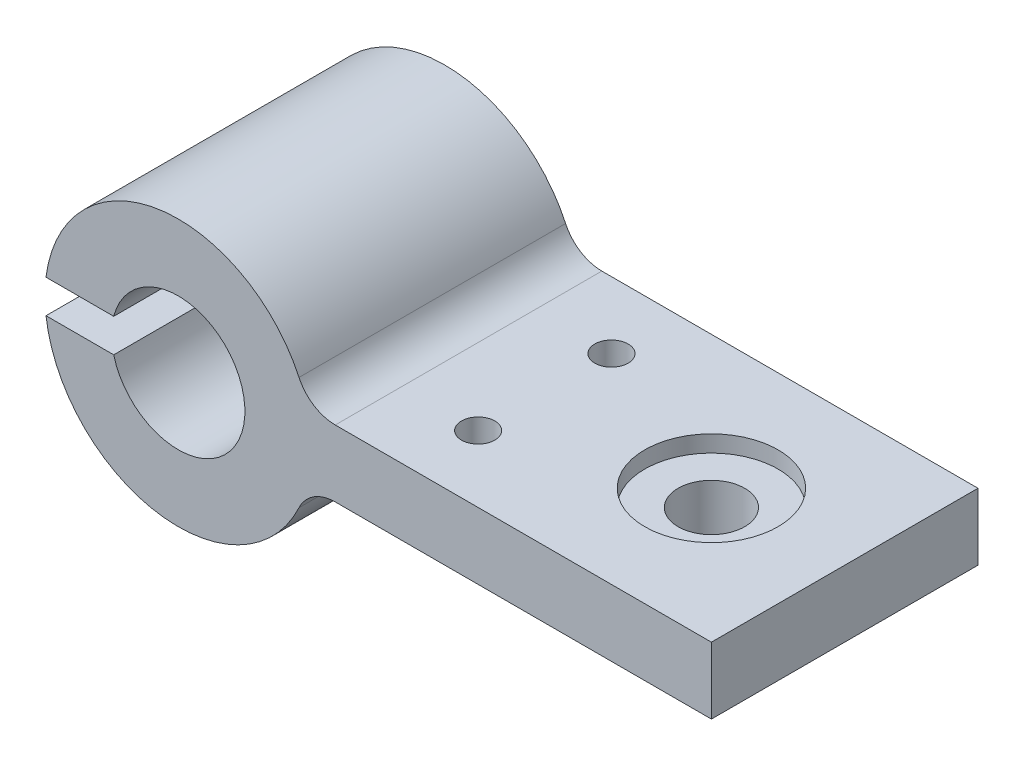
ISO-10303-21;
HEADER;
FILE_DESCRIPTION(('STEP AP214'),'2;1');
FILE_NAME('part.step','',(''),(''),'','','');
FILE_SCHEMA(('AUTOMOTIVE_DESIGN { 1 0 10303 214 1 1 1 1 }'));
ENDSEC;
DATA;
#1=APPLICATION_CONTEXT('core data for automotive mechanical design processes');
#2=APPLICATION_PROTOCOL_DEFINITION('international standard','automotive_design',2000,#1);
#3=PRODUCT_CONTEXT('',#1,'mechanical');
#4=PRODUCT('Part','Part','',(#3));
#5=PRODUCT_RELATED_PRODUCT_CATEGORY('part','',(#4));
#6=PRODUCT_DEFINITION_FORMATION('','',#4);
#7=PRODUCT_DEFINITION_CONTEXT('part definition',#1,'design');
#8=PRODUCT_DEFINITION('design','',#6,#7);
#9=PRODUCT_DEFINITION_SHAPE('','',#8);
#10=(LENGTH_UNIT() NAMED_UNIT(*) SI_UNIT(.MILLI.,.METRE.));
#11=(NAMED_UNIT(*) PLANE_ANGLE_UNIT() SI_UNIT($,.RADIAN.));
#12=(NAMED_UNIT(*) SI_UNIT($,.STERADIAN.) SOLID_ANGLE_UNIT());
#13=UNCERTAINTY_MEASURE_WITH_UNIT(LENGTH_MEASURE(1.E-05),#10,'distance_accuracy_value','');
#14=(GEOMETRIC_REPRESENTATION_CONTEXT(3) GLOBAL_UNCERTAINTY_ASSIGNED_CONTEXT((#13)) GLOBAL_UNIT_ASSIGNED_CONTEXT((#10,
#11,#12)) REPRESENTATION_CONTEXT('',''));
#15=CARTESIAN_POINT('',(0.,0.,0.));
#16=DIRECTION('',(0.,0.,1.));
#17=DIRECTION('',(1.,0.,0.));
#18=AXIS2_PLACEMENT_3D('',#15,#16,#17);
#19=CARTESIAN_POINT('',(0.,0.,50.8));
#20=DIRECTION('',(0.,0.,-1.));
#21=DIRECTION('',(-1.,0.,0.));
#22=AXIS2_PLACEMENT_3D('',#19,#20,#21);
#23=CYLINDRICAL_SURFACE('',#22,25.4);
#24=DIRECTION('',(0.,0.,1.));
#25=VECTOR('',#24,1.);
#26=CARTESIAN_POINT('',(-25.2007812378902,3.175,0.));
#27=LINE('',#26,#25);
#28=CARTESIAN_POINT('',(-25.2007812378902,3.175,0.));
#29=VERTEX_POINT('',#28);
#30=CARTESIAN_POINT('',(-25.2007812378902,3.175,50.8));
#31=VERTEX_POINT('',#30);
#32=EDGE_CURVE('E212',#29,#31,#27,.T.);
#33=ORIENTED_EDGE('',*,*,#32,.T.);
#34=CARTESIAN_POINT('',(0.,0.,50.8));
#35=DIRECTION('',(0.,0.,1.));
#36=DIRECTION('',(1.,0.,0.));
#37=AXIS2_PLACEMENT_3D('',#34,#35,#36);
#38=CIRCLE('',#37,25.4);
#39=CARTESIAN_POINT('',(23.0147817177307,10.7461538461538,50.8));
#40=VERTEX_POINT('',#39);
#41=EDGE_CURVE('E189',#40,#31,#38,.T.);
#42=ORIENTED_EDGE('',*,*,#41,.F.);
#43=DIRECTION('',(0.,0.,-1.));
#44=VECTOR('',#43,1.);
#45=CARTESIAN_POINT('',(23.0147817177307,10.7461538461538,50.8));
#46=LINE('',#45,#44);
#47=CARTESIAN_POINT('',(23.0147817177307,10.7461538461538,0.));
#48=VERTEX_POINT('',#47);
#49=EDGE_CURVE('E11',#40,#48,#46,.T.);
#50=ORIENTED_EDGE('',*,*,#49,.T.);
#51=CARTESIAN_POINT('',(0.,0.,0.));
#52=DIRECTION('',(0.,0.,1.));
#53=DIRECTION('',(1.,0.,0.));
#54=AXIS2_PLACEMENT_3D('',#51,#52,#53);
#55=CIRCLE('',#54,25.4);
#56=EDGE_CURVE('E147',#48,#29,#55,.T.);
#57=ORIENTED_EDGE('',*,*,#56,.T.);
#58=EDGE_LOOP('',(#33,#42,#50,#57));
#59=FACE_BOUND('',#58,.T.);
#60=ADVANCED_FACE('F33',(#59),#23,.T.);
#61=CARTESIAN_POINT('',(29.91921623305,13.97,50.8));
#62=DIRECTION('',(0.,0.,-1.));
#63=DIRECTION('',(-1.,0.,0.));
#64=AXIS2_PLACEMENT_3D('',#61,#62,#63);
#65=CYLINDRICAL_SURFACE('',#64,7.62);
#66=CARTESIAN_POINT('',(29.91921623305,13.97,0.));
#67=DIRECTION('',(0.,0.,1.));
#68=DIRECTION('',(1.,0.,0.));
#69=AXIS2_PLACEMENT_3D('',#66,#67,#68);
#70=CIRCLE('',#69,7.62);
#71=CARTESIAN_POINT('',(29.91921623305,6.35,0.));
#72=VERTEX_POINT('',#71);
#73=EDGE_CURVE('E143',#48,#72,#70,.T.);
#74=ORIENTED_EDGE('',*,*,#73,.F.);
#75=ORIENTED_EDGE('',*,*,#49,.F.);
#76=CARTESIAN_POINT('',(29.91921623305,13.97,50.8));
#77=DIRECTION('',(0.,0.,1.));
#78=DIRECTION('',(1.,0.,0.));
#79=AXIS2_PLACEMENT_3D('',#76,#77,#78);
#80=CIRCLE('',#79,7.62);
#81=CARTESIAN_POINT('',(29.91921623305,6.35,50.8));
#82=VERTEX_POINT('',#81);
#83=EDGE_CURVE('E157',#40,#82,#80,.T.);
#84=ORIENTED_EDGE('',*,*,#83,.T.);
#85=DIRECTION('',(0.,0.,-1.));
#86=VECTOR('',#85,1.);
#87=CARTESIAN_POINT('',(29.91921623305,6.35,50.8));
#88=LINE('',#87,#86);
#89=EDGE_CURVE('E103',#82,#72,#88,.T.);
#90=ORIENTED_EDGE('',*,*,#89,.T.);
#91=EDGE_LOOP('',(#74,#75,#84,#90));
#92=FACE_BOUND('',#91,.T.);
#93=ADVANCED_FACE('F35',(#92),#65,.F.);
#94=CARTESIAN_POINT('',(-25.2007812378902,-3.175,50.8));
#95=VERTEX_POINT('',#94);
#96=CARTESIAN_POINT('',(23.0147817177307,-10.7461538461538,50.8));
#97=VERTEX_POINT('',#96);
#98=EDGE_CURVE('E188',#95,#97,#38,.T.);
#99=ORIENTED_EDGE('',*,*,#98,.F.);
#100=DIRECTION('',(0.,0.,1.));
#101=VECTOR('',#100,1.);
#102=CARTESIAN_POINT('',(-25.2007812378902,-3.175,0.));
#103=LINE('',#102,#101);
#104=CARTESIAN_POINT('',(-25.2007812378902,-3.175,0.));
#105=VERTEX_POINT('',#104);
#106=EDGE_CURVE('E72',#105,#95,#103,.T.);
#107=ORIENTED_EDGE('',*,*,#106,.F.);
#108=CARTESIAN_POINT('',(23.0147817177307,-10.7461538461538,0.));
#109=VERTEX_POINT('',#108);
#110=EDGE_CURVE('E145',#105,#109,#55,.T.);
#111=ORIENTED_EDGE('',*,*,#110,.T.);
#112=DIRECTION('',(0.,0.,-1.));
#113=VECTOR('',#112,1.);
#114=CARTESIAN_POINT('',(23.0147817177307,-10.7461538461538,50.8));
#115=LINE('',#114,#113);
#116=EDGE_CURVE('E43',#97,#109,#115,.T.);
#117=ORIENTED_EDGE('',*,*,#116,.F.);
#118=EDGE_LOOP('',(#99,#107,#111,#117));
#119=FACE_BOUND('',#118,.T.);
#120=ADVANCED_FACE('F199',(#119),#23,.T.);
#121=CARTESIAN_POINT('',(29.91921623305,-13.97,50.8));
#122=DIRECTION('',(0.,0.,-1.));
#123=DIRECTION('',(-1.,0.,0.));
#124=AXIS2_PLACEMENT_3D('',#121,#122,#123);
#125=CYLINDRICAL_SURFACE('',#124,7.62);
#126=CARTESIAN_POINT('',(29.91921623305,-13.97,0.));
#127=DIRECTION('',(0.,0.,1.));
#128=DIRECTION('',(1.,0.,0.));
#129=AXIS2_PLACEMENT_3D('',#126,#127,#128);
#130=CIRCLE('',#129,7.62);
#131=CARTESIAN_POINT('',(29.91921623305,-6.35,0.));
#132=VERTEX_POINT('',#131);
#133=EDGE_CURVE('E149',#132,#109,#130,.T.);
#134=ORIENTED_EDGE('',*,*,#133,.F.);
#135=DIRECTION('',(0.,0.,-1.));
#136=VECTOR('',#135,1.);
#137=CARTESIAN_POINT('',(29.91921623305,-6.35,50.8));
#138=LINE('',#137,#136);
#139=CARTESIAN_POINT('',(29.91921623305,-6.35,50.8));
#140=VERTEX_POINT('',#139);
#141=EDGE_CURVE('E160',#140,#132,#138,.T.);
#142=ORIENTED_EDGE('',*,*,#141,.F.);
#143=CARTESIAN_POINT('',(29.91921623305,-13.97,50.8));
#144=DIRECTION('',(0.,0.,1.));
#145=DIRECTION('',(1.,0.,0.));
#146=AXIS2_PLACEMENT_3D('',#143,#144,#145);
#147=CIRCLE('',#146,7.62);
#148=EDGE_CURVE('E191',#140,#97,#147,.T.);
#149=ORIENTED_EDGE('',*,*,#148,.T.);
#150=ORIENTED_EDGE('',*,*,#116,.T.);
#151=EDGE_LOOP('',(#134,#142,#149,#150));
#152=FACE_BOUND('',#151,.T.);
#153=ADVANCED_FACE('F195',(#152),#125,.F.);
#154=CARTESIAN_POINT('',(0.,-6.35,50.8));
#155=DIRECTION('',(0.,1.,0.));
#156=DIRECTION('',(0.,0.,1.));
#157=AXIS2_PLACEMENT_3D('',#154,#155,#156);
#158=PLANE('',#157);
#159=CARTESIAN_POINT('',(44.45,-6.35,12.7));
#160=DIRECTION('',(0.,1.,0.));
#161=DIRECTION('',(0.,0.,1.));
#162=AXIS2_PLACEMENT_3D('',#159,#160,#161);
#163=CIRCLE('',#162,3.175);
#164=CARTESIAN_POINT('',(44.45,-6.35,15.875));
#165=VERTEX_POINT('',#164);
#166=EDGE_CURVE('E223',#165,#165,#163,.T.);
#167=ORIENTED_EDGE('',*,*,#166,.T.);
#168=EDGE_LOOP('',(#167));
#169=FACE_BOUND('',#168,.T.);
#170=CARTESIAN_POINT('',(44.45,-6.35,38.1));
#171=DIRECTION('',(0.,1.,0.));
#172=DIRECTION('',(0.,0.,1.));
#173=AXIS2_PLACEMENT_3D('',#170,#171,#172);
#174=CIRCLE('',#173,3.175);
#175=CARTESIAN_POINT('',(44.45,-6.35,41.275));
#176=VERTEX_POINT('',#175);
#177=EDGE_CURVE('E283',#176,#176,#174,.T.);
#178=ORIENTED_EDGE('',*,*,#177,.T.);
#179=EDGE_LOOP('',(#178));
#180=FACE_BOUND('',#179,.T.);
#181=CARTESIAN_POINT('',(76.2,-6.35,25.4));
#182=DIRECTION('',(0.,1.,0.));
#183=DIRECTION('',(0.,0.,1.));
#184=AXIS2_PLACEMENT_3D('',#181,#182,#183);
#185=CIRCLE('',#184,6.35);
#186=CARTESIAN_POINT('',(76.2,-6.35,31.75));
#187=VERTEX_POINT('',#186);
#188=EDGE_CURVE('E164',#187,#187,#185,.T.);
#189=ORIENTED_EDGE('',*,*,#188,.T.);
#190=EDGE_LOOP('',(#189));
#191=FACE_BOUND('',#190,.T.);
#192=DIRECTION('',(1.,0.,0.));
#193=VECTOR('',#192,1.);
#194=CARTESIAN_POINT('',(0.,-6.35,0.));
#195=LINE('',#194,#193);
#196=CARTESIAN_POINT('',(101.6,-6.35,0.));
#197=VERTEX_POINT('',#196);
#198=EDGE_CURVE('E152',#132,#197,#195,.T.);
#199=ORIENTED_EDGE('',*,*,#198,.T.);
#200=DIRECTION('',(0.,0.,-1.));
#201=VECTOR('',#200,1.);
#202=CARTESIAN_POINT('',(101.6,-6.35,50.8));
#203=LINE('',#202,#201);
#204=CARTESIAN_POINT('',(101.6,-6.35,50.8));
#205=VERTEX_POINT('',#204);
#206=EDGE_CURVE('E126',#205,#197,#203,.T.);
#207=ORIENTED_EDGE('',*,*,#206,.F.);
#208=DIRECTION('',(1.,0.,0.));
#209=VECTOR('',#208,1.);
#210=CARTESIAN_POINT('',(0.,-6.35,50.8));
#211=LINE('',#210,#209);
#212=EDGE_CURVE('E135',#140,#205,#211,.T.);
#213=ORIENTED_EDGE('',*,*,#212,.F.);
#214=ORIENTED_EDGE('',*,*,#141,.T.);
#215=EDGE_LOOP('',(#199,#207,#213,#214));
#216=FACE_BOUND('',#215,.T.);
#217=ADVANCED_FACE('F237',(#169,#180,#191,#216),#158,.F.);
#218=CARTESIAN_POINT('',(101.6,0.,50.8));
#219=DIRECTION('',(1.,0.,0.));
#220=DIRECTION('',(0.,0.,-1.));
#221=AXIS2_PLACEMENT_3D('',#218,#219,#220);
#222=PLANE('',#221);
#223=DIRECTION('',(0.,-1.,0.));
#224=VECTOR('',#223,1.);
#225=CARTESIAN_POINT('',(101.6,0.,0.));
#226=LINE('',#225,#224);
#227=CARTESIAN_POINT('',(101.6,6.35,0.));
#228=VERTEX_POINT('',#227);
#229=EDGE_CURVE('E124',#228,#197,#226,.T.);
#230=ORIENTED_EDGE('',*,*,#229,.F.);
#231=DIRECTION('',(0.,0.,-1.));
#232=VECTOR('',#231,1.);
#233=CARTESIAN_POINT('',(101.6,6.35,50.8));
#234=LINE('',#233,#232);
#235=CARTESIAN_POINT('',(101.6,6.35,50.8));
#236=VERTEX_POINT('',#235);
#237=EDGE_CURVE('E96',#236,#228,#234,.T.);
#238=ORIENTED_EDGE('',*,*,#237,.F.);
#239=DIRECTION('',(0.,-1.,0.));
#240=VECTOR('',#239,1.);
#241=CARTESIAN_POINT('',(101.6,0.,50.8));
#242=LINE('',#241,#240);
#243=EDGE_CURVE('E122',#236,#205,#242,.T.);
#244=ORIENTED_EDGE('',*,*,#243,.T.);
#245=ORIENTED_EDGE('',*,*,#206,.T.);
#246=EDGE_LOOP('',(#230,#238,#244,#245));
#247=FACE_BOUND('',#246,.T.);
#248=ADVANCED_FACE('F121',(#247),#222,.T.);
#249=CARTESIAN_POINT('',(0.,6.35,50.8));
#250=DIRECTION('',(0.,1.,0.));
#251=DIRECTION('',(0.,0.,1.));
#252=AXIS2_PLACEMENT_3D('',#249,#250,#251);
#253=PLANE('',#252);
#254=CARTESIAN_POINT('',(44.45,6.35,12.7));
#255=DIRECTION('',(0.,1.,0.));
#256=DIRECTION('',(0.,0.,1.));
#257=AXIS2_PLACEMENT_3D('',#254,#255,#256);
#258=CIRCLE('',#257,3.175);
#259=CARTESIAN_POINT('',(44.45,6.35,15.875));
#260=VERTEX_POINT('',#259);
#261=EDGE_CURVE('E280',#260,#260,#258,.T.);
#262=ORIENTED_EDGE('',*,*,#261,.F.);
#263=EDGE_LOOP('',(#262));
#264=FACE_BOUND('',#263,.T.);
#265=CARTESIAN_POINT('',(44.45,6.35,38.1));
#266=DIRECTION('',(0.,1.,0.));
#267=DIRECTION('',(0.,0.,1.));
#268=AXIS2_PLACEMENT_3D('',#265,#266,#267);
#269=CIRCLE('',#268,3.175);
#270=CARTESIAN_POINT('',(44.45,6.35,41.275));
#271=VERTEX_POINT('',#270);
#272=EDGE_CURVE('E287',#271,#271,#269,.T.);
#273=ORIENTED_EDGE('',*,*,#272,.F.);
#274=EDGE_LOOP('',(#273));
#275=FACE_BOUND('',#274,.T.);
#276=CARTESIAN_POINT('',(76.2,6.35,25.4));
#277=DIRECTION('',(0.,1.,0.));
#278=DIRECTION('',(0.,0.,1.));
#279=AXIS2_PLACEMENT_3D('',#276,#277,#278);
#280=CIRCLE('',#279,12.7);
#281=CARTESIAN_POINT('',(76.2,6.35,38.1));
#282=VERTEX_POINT('',#281);
#283=EDGE_CURVE('E167',#282,#282,#280,.T.);
#284=ORIENTED_EDGE('',*,*,#283,.F.);
#285=EDGE_LOOP('',(#284));
#286=FACE_BOUND('',#285,.T.);
#287=DIRECTION('',(1.,0.,0.));
#288=VECTOR('',#287,1.);
#289=CARTESIAN_POINT('',(0.,6.35,0.));
#290=LINE('',#289,#288);
#291=EDGE_CURVE('E156',#72,#228,#290,.T.);
#292=ORIENTED_EDGE('',*,*,#291,.F.);
#293=ORIENTED_EDGE('',*,*,#89,.F.);
#294=DIRECTION('',(1.,0.,0.));
#295=VECTOR('',#294,1.);
#296=CARTESIAN_POINT('',(0.,6.35,50.8));
#297=LINE('',#296,#295);
#298=EDGE_CURVE('E132',#82,#236,#297,.T.);
#299=ORIENTED_EDGE('',*,*,#298,.T.);
#300=ORIENTED_EDGE('',*,*,#237,.T.);
#301=EDGE_LOOP('',(#292,#293,#299,#300));
#302=FACE_BOUND('',#301,.T.);
#303=ADVANCED_FACE('F138',(#264,#275,#286,#302),#253,.T.);
#304=CARTESIAN_POINT('',(0.,0.,50.8));
#305=DIRECTION('',(0.,0.,1.));
#306=DIRECTION('',(1.,0.,0.));
#307=AXIS2_PLACEMENT_3D('',#304,#305,#306);
#308=PLANE('',#307);
#309=DIRECTION('',(1.,0.,0.));
#310=VECTOR('',#309,1.);
#311=CARTESIAN_POINT('',(0.,-3.175,50.8));
#312=LINE('',#311,#310);
#313=CARTESIAN_POINT('',(-12.2967221242085,-3.175,50.8));
#314=VERTEX_POINT('',#313);
#315=EDGE_CURVE('E37',#95,#314,#312,.T.);
#316=ORIENTED_EDGE('',*,*,#315,.F.);
#317=ORIENTED_EDGE('',*,*,#98,.T.);
#318=ORIENTED_EDGE('',*,*,#148,.F.);
#319=ORIENTED_EDGE('',*,*,#212,.T.);
#320=ORIENTED_EDGE('',*,*,#243,.F.);
#321=ORIENTED_EDGE('',*,*,#298,.F.);
#322=ORIENTED_EDGE('',*,*,#83,.F.);
#323=ORIENTED_EDGE('',*,*,#41,.T.);
#324=DIRECTION('',(1.,0.,0.));
#325=VECTOR('',#324,1.);
#326=CARTESIAN_POINT('',(0.,3.175,50.8));
#327=LINE('',#326,#325);
#328=CARTESIAN_POINT('',(-12.2967221242085,3.175,50.8));
#329=VERTEX_POINT('',#328);
#330=EDGE_CURVE('E170',#31,#329,#327,.T.);
#331=ORIENTED_EDGE('',*,*,#330,.T.);
#332=CARTESIAN_POINT('',(0.,0.,50.8));
#333=DIRECTION('',(0.,0.,1.));
#334=DIRECTION('',(1.,0.,0.));
#335=AXIS2_PLACEMENT_3D('',#332,#333,#334);
#336=CIRCLE('',#335,12.7);
#337=EDGE_CURVE('E169',#314,#329,#336,.T.);
#338=ORIENTED_EDGE('',*,*,#337,.F.);
#339=EDGE_LOOP('',(#316,#317,#318,#319,#320,#321,#322,#323,#331,#338));
#340=FACE_BOUND('',#339,.T.);
#341=ADVANCED_FACE('F130',(#340),#308,.T.);
#342=CARTESIAN_POINT('',(0.,0.,0.));
#343=DIRECTION('',(0.,0.,1.));
#344=DIRECTION('',(1.,0.,0.));
#345=AXIS2_PLACEMENT_3D('',#342,#343,#344);
#346=PLANE('',#345);
#347=ORIENTED_EDGE('',*,*,#110,.F.);
#348=DIRECTION('',(1.,0.,0.));
#349=VECTOR('',#348,1.);
#350=CARTESIAN_POINT('',(0.,-3.175,0.));
#351=LINE('',#350,#349);
#352=CARTESIAN_POINT('',(-12.2967221242085,-3.175,0.));
#353=VERTEX_POINT('',#352);
#354=EDGE_CURVE('E206',#105,#353,#351,.T.);
#355=ORIENTED_EDGE('',*,*,#354,.T.);
#356=CARTESIAN_POINT('',(0.,0.,0.));
#357=DIRECTION('',(0.,0.,1.));
#358=DIRECTION('',(1.,0.,0.));
#359=AXIS2_PLACEMENT_3D('',#356,#357,#358);
#360=CIRCLE('',#359,12.7);
#361=CARTESIAN_POINT('',(-12.2967221242085,3.175,0.));
#362=VERTEX_POINT('',#361);
#363=EDGE_CURVE('E219',#353,#362,#360,.T.);
#364=ORIENTED_EDGE('',*,*,#363,.T.);
#365=DIRECTION('',(1.,0.,0.));
#366=VECTOR('',#365,1.);
#367=CARTESIAN_POINT('',(0.,3.175,0.));
#368=LINE('',#367,#366);
#369=EDGE_CURVE('E217',#29,#362,#368,.T.);
#370=ORIENTED_EDGE('',*,*,#369,.F.);
#371=ORIENTED_EDGE('',*,*,#56,.F.);
#372=ORIENTED_EDGE('',*,*,#73,.T.);
#373=ORIENTED_EDGE('',*,*,#291,.T.);
#374=ORIENTED_EDGE('',*,*,#229,.T.);
#375=ORIENTED_EDGE('',*,*,#198,.F.);
#376=ORIENTED_EDGE('',*,*,#133,.T.);
#377=EDGE_LOOP('',(#347,#355,#364,#370,#371,#372,#373,#374,#375,#376));
#378=FACE_BOUND('',#377,.T.);
#379=ADVANCED_FACE('F203',(#378),#346,.F.);
#380=CARTESIAN_POINT('',(76.2,3.175,25.4));
#381=DIRECTION('',(0.,1.,0.));
#382=DIRECTION('',(0.,0.,1.));
#383=AXIS2_PLACEMENT_3D('',#380,#381,#382);
#384=CYLINDRICAL_SURFACE('',#383,12.7);
#385=CARTESIAN_POINT('',(76.2,3.175,25.4));
#386=DIRECTION('',(0.,1.,0.));
#387=DIRECTION('',(0.,0.,1.));
#388=AXIS2_PLACEMENT_3D('',#385,#386,#387);
#389=CIRCLE('',#388,12.7);
#390=CARTESIAN_POINT('',(76.2,3.175,38.1));
#391=VERTEX_POINT('',#390);
#392=EDGE_CURVE('E146',#391,#391,#389,.T.);
#393=ORIENTED_EDGE('',*,*,#392,.F.);
#394=EDGE_LOOP('',(#393));
#395=FACE_BOUND('',#394,.T.);
#396=ORIENTED_EDGE('',*,*,#283,.T.);
#397=EDGE_LOOP('',(#396));
#398=FACE_BOUND('',#397,.T.);
#399=ADVANCED_FACE('F248',(#395,#398),#384,.F.);
#400=CARTESIAN_POINT('',(76.2,3.175,25.4));
#401=DIRECTION('',(0.,1.,0.));
#402=DIRECTION('',(0.,0.,1.));
#403=AXIS2_PLACEMENT_3D('',#400,#401,#402);
#404=PLANE('',#403);
#405=CARTESIAN_POINT('',(76.2,3.175,25.4));
#406=DIRECTION('',(0.,1.,0.));
#407=DIRECTION('',(0.,0.,1.));
#408=AXIS2_PLACEMENT_3D('',#405,#406,#407);
#409=CIRCLE('',#408,6.35);
#410=CARTESIAN_POINT('',(76.2,3.175,31.75));
#411=VERTEX_POINT('',#410);
#412=EDGE_CURVE('E168',#411,#411,#409,.T.);
#413=ORIENTED_EDGE('',*,*,#412,.F.);
#414=EDGE_LOOP('',(#413));
#415=FACE_BOUND('',#414,.T.);
#416=ORIENTED_EDGE('',*,*,#392,.T.);
#417=EDGE_LOOP('',(#416));
#418=FACE_BOUND('',#417,.T.);
#419=ADVANCED_FACE('F253',(#415,#418),#404,.T.);
#420=CARTESIAN_POINT('',(76.2,-25.4,25.4));
#421=DIRECTION('',(0.,1.,0.));
#422=DIRECTION('',(0.,0.,1.));
#423=AXIS2_PLACEMENT_3D('',#420,#421,#422);
#424=CYLINDRICAL_SURFACE('',#423,6.35);
#425=ORIENTED_EDGE('',*,*,#412,.T.);
#426=EDGE_LOOP('',(#425));
#427=FACE_BOUND('',#426,.T.);
#428=ORIENTED_EDGE('',*,*,#188,.F.);
#429=EDGE_LOOP('',(#428));
#430=FACE_BOUND('',#429,.T.);
#431=ADVANCED_FACE('F257',(#427,#430),#424,.F.);
#432=CARTESIAN_POINT('',(0.,-3.175,0.));
#433=DIRECTION('',(0.,-1.,0.));
#434=DIRECTION('',(0.,0.,-1.));
#435=AXIS2_PLACEMENT_3D('',#432,#433,#434);
#436=PLANE('',#435);
#437=ORIENTED_EDGE('',*,*,#315,.T.);
#438=DIRECTION('',(0.,0.,1.));
#439=VECTOR('',#438,1.);
#440=CARTESIAN_POINT('',(-12.2967221242085,-3.175,0.));
#441=LINE('',#440,#439);
#442=EDGE_CURVE('E215',#353,#314,#441,.T.);
#443=ORIENTED_EDGE('',*,*,#442,.F.);
#444=ORIENTED_EDGE('',*,*,#354,.F.);
#445=ORIENTED_EDGE('',*,*,#106,.T.);
#446=EDGE_LOOP('',(#437,#443,#444,#445));
#447=FACE_BOUND('',#446,.T.);
#448=ADVANCED_FACE('F216',(#447),#436,.F.);
#449=CARTESIAN_POINT('',(0.,3.175,0.));
#450=DIRECTION('',(0.,-1.,0.));
#451=DIRECTION('',(0.,0.,-1.));
#452=AXIS2_PLACEMENT_3D('',#449,#450,#451);
#453=PLANE('',#452);
#454=ORIENTED_EDGE('',*,*,#32,.F.);
#455=ORIENTED_EDGE('',*,*,#369,.T.);
#456=DIRECTION('',(0.,0.,1.));
#457=VECTOR('',#456,1.);
#458=CARTESIAN_POINT('',(-12.2967221242085,3.175,0.));
#459=LINE('',#458,#457);
#460=EDGE_CURVE('E52',#362,#329,#459,.T.);
#461=ORIENTED_EDGE('',*,*,#460,.T.);
#462=ORIENTED_EDGE('',*,*,#330,.F.);
#463=EDGE_LOOP('',(#454,#455,#461,#462));
#464=FACE_BOUND('',#463,.T.);
#465=ADVANCED_FACE('F263',(#464),#453,.T.);
#466=CARTESIAN_POINT('',(0.,0.,0.));
#467=DIRECTION('',(0.,0.,1.));
#468=DIRECTION('',(1.,0.,0.));
#469=AXIS2_PLACEMENT_3D('',#466,#467,#468);
#470=CYLINDRICAL_SURFACE('',#469,12.7);
#471=ORIENTED_EDGE('',*,*,#337,.T.);
#472=ORIENTED_EDGE('',*,*,#460,.F.);
#473=ORIENTED_EDGE('',*,*,#363,.F.);
#474=ORIENTED_EDGE('',*,*,#442,.T.);
#475=EDGE_LOOP('',(#471,#472,#473,#474));
#476=FACE_BOUND('',#475,.T.);
#477=ADVANCED_FACE('F220',(#476),#470,.F.);
#478=CARTESIAN_POINT('',(44.45,-25.4,38.1));
#479=DIRECTION('',(0.,1.,0.));
#480=DIRECTION('',(0.,0.,1.));
#481=AXIS2_PLACEMENT_3D('',#478,#479,#480);
#482=CYLINDRICAL_SURFACE('',#481,3.175);
#483=ORIENTED_EDGE('',*,*,#272,.T.);
#484=EDGE_LOOP('',(#483));
#485=FACE_BOUND('',#484,.T.);
#486=ORIENTED_EDGE('',*,*,#177,.F.);
#487=EDGE_LOOP('',(#486));
#488=FACE_BOUND('',#487,.T.);
#489=ADVANCED_FACE('F266',(#485,#488),#482,.F.);
#490=CARTESIAN_POINT('',(44.45,-25.4,12.7));
#491=DIRECTION('',(0.,1.,0.));
#492=DIRECTION('',(0.,0.,1.));
#493=AXIS2_PLACEMENT_3D('',#490,#491,#492);
#494=CYLINDRICAL_SURFACE('',#493,3.175);
#495=ORIENTED_EDGE('',*,*,#261,.T.);
#496=EDGE_LOOP('',(#495));
#497=FACE_BOUND('',#496,.T.);
#498=ORIENTED_EDGE('',*,*,#166,.F.);
#499=EDGE_LOOP('',(#498));
#500=FACE_BOUND('',#499,.T.);
#501=ADVANCED_FACE('F271',(#497,#500),#494,.F.);
#502=CLOSED_SHELL('',(#60,#93,#120,#153,#217,#248,#303,#341,#379,#399,#419,#431,#448,#465,#477,
#489,#501));
#503=MANIFOLD_SOLID_BREP('B2',#502);
#504=ADVANCED_BREP_SHAPE_REPRESENTATION('',(#18,#503),#14);
#505=SHAPE_DEFINITION_REPRESENTATION(#9,#504);
ENDSEC;
END-ISO-10303-21;
